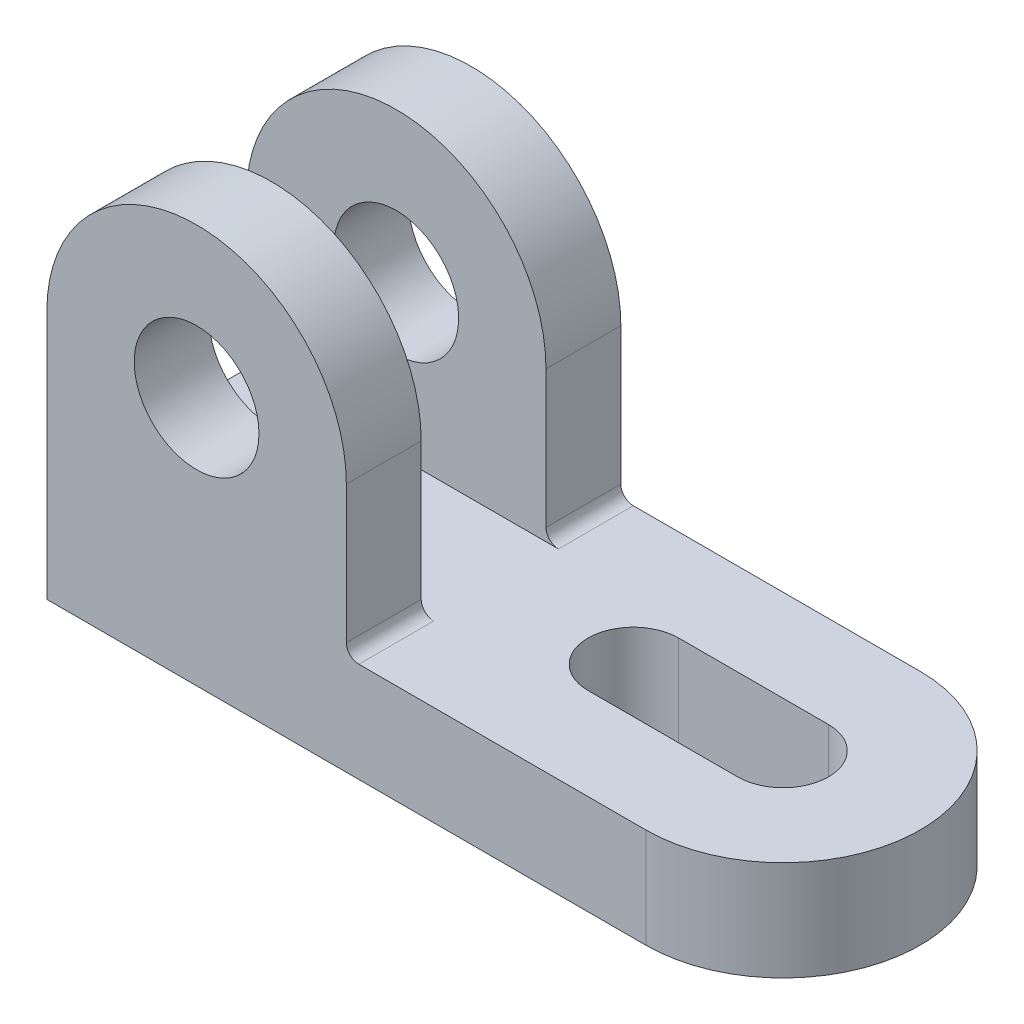
ISO-10303-21;
HEADER;
FILE_DESCRIPTION(('STEP AP214'),'2;1');
FILE_NAME('part.step','',(''),(''),'','','');
FILE_SCHEMA(('AUTOMOTIVE_DESIGN { 1 0 10303 214 1 1 1 1 }'));
ENDSEC;
DATA;
#1=APPLICATION_CONTEXT('core data for automotive mechanical design processes');
#2=APPLICATION_PROTOCOL_DEFINITION('international standard','automotive_design',2000,#1);
#3=PRODUCT_CONTEXT('',#1,'mechanical');
#4=PRODUCT('Part','Part','',(#3));
#5=PRODUCT_RELATED_PRODUCT_CATEGORY('part','',(#4));
#6=PRODUCT_DEFINITION_FORMATION('','',#4);
#7=PRODUCT_DEFINITION_CONTEXT('part definition',#1,'design');
#8=PRODUCT_DEFINITION('design','',#6,#7);
#9=PRODUCT_DEFINITION_SHAPE('','',#8);
#10=(LENGTH_UNIT() NAMED_UNIT(*) SI_UNIT(.MILLI.,.METRE.));
#11=(NAMED_UNIT(*) PLANE_ANGLE_UNIT() SI_UNIT($,.RADIAN.));
#12=(NAMED_UNIT(*) SI_UNIT($,.STERADIAN.) SOLID_ANGLE_UNIT());
#13=UNCERTAINTY_MEASURE_WITH_UNIT(LENGTH_MEASURE(1.E-05),#10,'distance_accuracy_value','');
#14=(GEOMETRIC_REPRESENTATION_CONTEXT(3) GLOBAL_UNCERTAINTY_ASSIGNED_CONTEXT((#13)) GLOBAL_UNIT_ASSIGNED_CONTEXT((#10,
#11,#12)) REPRESENTATION_CONTEXT('',''));
#15=CARTESIAN_POINT('',(0.,0.,0.));
#16=DIRECTION('',(0.,0.,1.));
#17=DIRECTION('',(1.,0.,0.));
#18=AXIS2_PLACEMENT_3D('',#15,#16,#17);
#19=CARTESIAN_POINT('',(48.,16.,0.));
#20=DIRECTION('',(0.,1.,0.));
#21=DIRECTION('',(0.,0.,1.));
#22=AXIS2_PLACEMENT_3D('',#19,#20,#21);
#23=PLANE('',#22);
#24=DIRECTION('',(-1.,0.,0.));
#25=VECTOR('',#24,1.);
#26=CARTESIAN_POINT('',(48.,16.,-7.27633480639501));
#27=LINE('',#26,#25);
#28=CARTESIAN_POINT('',(48.,16.,-7.27633480639501));
#29=VERTEX_POINT('',#28);
#30=CARTESIAN_POINT('',(24.,16.,-7.276334806395));
#31=VERTEX_POINT('',#30);
#32=EDGE_CURVE('E212',#29,#31,#27,.T.);
#33=ORIENTED_EDGE('',*,*,#32,.F.);
#34=CARTESIAN_POINT('',(48.,16.,0.));
#35=DIRECTION('',(0.,1.,0.));
#36=DIRECTION('',(0.,0.,1.));
#37=AXIS2_PLACEMENT_3D('',#34,#35,#36);
#38=CIRCLE('',#37,7.27633480639501);
#39=CARTESIAN_POINT('',(48.,16.,7.27633480639501));
#40=VERTEX_POINT('',#39);
#41=EDGE_CURVE('E210',#40,#29,#38,.T.);
#42=ORIENTED_EDGE('',*,*,#41,.F.);
#43=DIRECTION('',(1.,0.,0.));
#44=VECTOR('',#43,1.);
#45=CARTESIAN_POINT('',(48.,16.,7.27633480639501));
#46=LINE('',#45,#44);
#47=CARTESIAN_POINT('',(24.,16.,7.27633480639502));
#48=VERTEX_POINT('',#47);
#49=EDGE_CURVE('E218',#48,#40,#46,.T.);
#50=ORIENTED_EDGE('',*,*,#49,.F.);
#51=CARTESIAN_POINT('',(24.,16.,0.));
#52=DIRECTION('',(0.,1.,0.));
#53=DIRECTION('',(0.,0.,1.));
#54=AXIS2_PLACEMENT_3D('',#51,#52,#53);
#55=CIRCLE('',#54,7.27633480639501);
#56=EDGE_CURVE('E215',#31,#48,#55,.T.);
#57=ORIENTED_EDGE('',*,*,#56,.F.);
#58=EDGE_LOOP('',(#33,#42,#50,#57));
#59=FACE_BOUND('',#58,.T.);
#60=DIRECTION('',(-1.,0.,0.));
#61=VECTOR('',#60,1.);
#62=CARTESIAN_POINT('',(-48.,16.,-22.));
#63=LINE('',#62,#61);
#64=CARTESIAN_POINT('',(48.,16.,-22.));
#65=VERTEX_POINT('',#64);
#66=CARTESIAN_POINT('',(2.,16.,-22.));
#67=VERTEX_POINT('',#66);
#68=EDGE_CURVE('E244',#65,#67,#63,.T.);
#69=ORIENTED_EDGE('',*,*,#68,.T.);
#70=DIRECTION('',(0.,0.,-1.));
#71=VECTOR('',#70,1.);
#72=CARTESIAN_POINT('',(2.,16.,0.));
#73=LINE('',#72,#71);
#74=CARTESIAN_POINT('',(2.,16.,-10.));
#75=VERTEX_POINT('',#74);
#76=EDGE_CURVE('E281',#67,#75,#73,.F.);
#77=ORIENTED_EDGE('',*,*,#76,.T.);
#78=DIRECTION('',(1.,0.,0.));
#79=VECTOR('',#78,1.);
#80=CARTESIAN_POINT('',(0.,16.,-10.));
#81=LINE('',#80,#79);
#82=CARTESIAN_POINT('',(-48.,16.,-10.));
#83=VERTEX_POINT('',#82);
#84=EDGE_CURVE('E48',#83,#75,#81,.T.);
#85=ORIENTED_EDGE('',*,*,#84,.F.);
#86=DIRECTION('',(0.,0.,1.));
#87=VECTOR('',#86,1.);
#88=CARTESIAN_POINT('',(-48.,16.,-22.));
#89=LINE('',#88,#87);
#90=CARTESIAN_POINT('',(-48.,16.,10.));
#91=VERTEX_POINT('',#90);
#92=EDGE_CURVE('E167',#83,#91,#89,.T.);
#93=ORIENTED_EDGE('',*,*,#92,.T.);
#94=DIRECTION('',(-1.,0.,0.));
#95=VECTOR('',#94,1.);
#96=CARTESIAN_POINT('',(0.,16.,10.));
#97=LINE('',#96,#95);
#98=CARTESIAN_POINT('',(2.,16.,10.));
#99=VERTEX_POINT('',#98);
#100=EDGE_CURVE('E194',#99,#91,#97,.T.);
#101=ORIENTED_EDGE('',*,*,#100,.F.);
#102=DIRECTION('',(0.,0.,1.));
#103=VECTOR('',#102,1.);
#104=CARTESIAN_POINT('',(2.,16.,22.));
#105=LINE('',#104,#103);
#106=CARTESIAN_POINT('',(2.,16.,22.));
#107=VERTEX_POINT('',#106);
#108=EDGE_CURVE('E268',#99,#107,#105,.T.);
#109=ORIENTED_EDGE('',*,*,#108,.T.);
#110=DIRECTION('',(1.,0.,0.));
#111=VECTOR('',#110,1.);
#112=CARTESIAN_POINT('',(-48.,16.,22.));
#113=LINE('',#112,#111);
#114=CARTESIAN_POINT('',(48.,16.,22.));
#115=VERTEX_POINT('',#114);
#116=EDGE_CURVE('E248',#107,#115,#113,.T.);
#117=ORIENTED_EDGE('',*,*,#116,.T.);
#118=CARTESIAN_POINT('',(48.,16.,0.));
#119=DIRECTION('',(0.,1.,0.));
#120=DIRECTION('',(0.,0.,1.));
#121=AXIS2_PLACEMENT_3D('',#118,#119,#120);
#122=CIRCLE('',#121,22.);
#123=EDGE_CURVE('E241',#115,#65,#122,.T.);
#124=ORIENTED_EDGE('',*,*,#123,.T.);
#125=EDGE_LOOP('',(#69,#77,#85,#93,#101,#109,#117,#124));
#126=FACE_BOUND('',#125,.T.);
#127=ADVANCED_FACE('F34',(#59,#126),#23,.T.);
#128=CARTESIAN_POINT('',(48.,0.,0.));
#129=DIRECTION('',(0.,1.,0.));
#130=DIRECTION('',(0.,0.,1.));
#131=AXIS2_PLACEMENT_3D('',#128,#129,#130);
#132=PLANE('',#131);
#133=CARTESIAN_POINT('',(48.,0.,0.));
#134=DIRECTION('',(0.,1.,0.));
#135=DIRECTION('',(0.,0.,1.));
#136=AXIS2_PLACEMENT_3D('',#133,#134,#135);
#137=CIRCLE('',#136,22.);
#138=CARTESIAN_POINT('',(48.,0.,22.));
#139=VERTEX_POINT('',#138);
#140=CARTESIAN_POINT('',(48.,0.,-22.));
#141=VERTEX_POINT('',#140);
#142=EDGE_CURVE('E240',#139,#141,#137,.T.);
#143=ORIENTED_EDGE('',*,*,#142,.F.);
#144=DIRECTION('',(1.,0.,0.));
#145=VECTOR('',#144,1.);
#146=CARTESIAN_POINT('',(-48.,0.,22.));
#147=LINE('',#146,#145);
#148=CARTESIAN_POINT('',(-48.,0.,22.));
#149=VERTEX_POINT('',#148);
#150=EDGE_CURVE('E245',#149,#139,#147,.T.);
#151=ORIENTED_EDGE('',*,*,#150,.F.);
#152=DIRECTION('',(0.,0.,1.));
#153=VECTOR('',#152,1.);
#154=CARTESIAN_POINT('',(-48.,0.,-22.));
#155=LINE('',#154,#153);
#156=CARTESIAN_POINT('',(-48.,0.,-22.));
#157=VERTEX_POINT('',#156);
#158=EDGE_CURVE('E255',#157,#149,#155,.T.);
#159=ORIENTED_EDGE('',*,*,#158,.F.);
#160=DIRECTION('',(-1.,0.,0.));
#161=VECTOR('',#160,1.);
#162=CARTESIAN_POINT('',(-48.,0.,-22.));
#163=LINE('',#162,#161);
#164=EDGE_CURVE('E253',#141,#157,#163,.T.);
#165=ORIENTED_EDGE('',*,*,#164,.F.);
#166=EDGE_LOOP('',(#143,#151,#159,#165));
#167=FACE_BOUND('',#166,.T.);
#168=CARTESIAN_POINT('',(48.,0.,0.));
#169=DIRECTION('',(0.,1.,0.));
#170=DIRECTION('',(0.,0.,1.));
#171=AXIS2_PLACEMENT_3D('',#168,#169,#170);
#172=CIRCLE('',#171,7.27633480639501);
#173=CARTESIAN_POINT('',(48.,0.,7.27633480639501));
#174=VERTEX_POINT('',#173);
#175=CARTESIAN_POINT('',(48.,0.,-7.27633480639501));
#176=VERTEX_POINT('',#175);
#177=EDGE_CURVE('E207',#174,#176,#172,.T.);
#178=ORIENTED_EDGE('',*,*,#177,.T.);
#179=DIRECTION('',(-1.,0.,0.));
#180=VECTOR('',#179,1.);
#181=CARTESIAN_POINT('',(48.,0.,-7.27633480639501));
#182=LINE('',#181,#180);
#183=CARTESIAN_POINT('',(24.,0.,-7.276334806395));
#184=VERTEX_POINT('',#183);
#185=EDGE_CURVE('E223',#176,#184,#182,.T.);
#186=ORIENTED_EDGE('',*,*,#185,.T.);
#187=CARTESIAN_POINT('',(24.,0.,0.));
#188=DIRECTION('',(0.,1.,0.));
#189=DIRECTION('',(0.,0.,1.));
#190=AXIS2_PLACEMENT_3D('',#187,#188,#189);
#191=CIRCLE('',#190,7.27633480639501);
#192=CARTESIAN_POINT('',(24.,0.,7.27633480639502));
#193=VERTEX_POINT('',#192);
#194=EDGE_CURVE('E226',#184,#193,#191,.T.);
#195=ORIENTED_EDGE('',*,*,#194,.T.);
#196=DIRECTION('',(1.,0.,0.));
#197=VECTOR('',#196,1.);
#198=CARTESIAN_POINT('',(48.,0.,7.27633480639501));
#199=LINE('',#198,#197);
#200=EDGE_CURVE('E213',#193,#174,#199,.T.);
#201=ORIENTED_EDGE('',*,*,#200,.T.);
#202=EDGE_LOOP('',(#178,#186,#195,#201));
#203=FACE_BOUND('',#202,.T.);
#204=ADVANCED_FACE('F295',(#167,#203),#132,.F.);
#205=CARTESIAN_POINT('',(48.,16.,0.));
#206=DIRECTION('',(0.,-1.,0.));
#207=DIRECTION('',(0.,0.,-1.));
#208=AXIS2_PLACEMENT_3D('',#205,#206,#207);
#209=CYLINDRICAL_SURFACE('',#208,22.);
#210=ORIENTED_EDGE('',*,*,#142,.T.);
#211=DIRECTION('',(0.,-1.,0.));
#212=VECTOR('',#211,1.);
#213=CARTESIAN_POINT('',(48.,16.,-22.));
#214=LINE('',#213,#212);
#215=EDGE_CURVE('E265',#65,#141,#214,.T.);
#216=ORIENTED_EDGE('',*,*,#215,.F.);
#217=ORIENTED_EDGE('',*,*,#123,.F.);
#218=DIRECTION('',(0.,-1.,0.));
#219=VECTOR('',#218,1.);
#220=CARTESIAN_POINT('',(48.,16.,22.));
#221=LINE('',#220,#219);
#222=EDGE_CURVE('E250',#115,#139,#221,.T.);
#223=ORIENTED_EDGE('',*,*,#222,.T.);
#224=EDGE_LOOP('',(#210,#216,#217,#223));
#225=FACE_BOUND('',#224,.T.);
#226=ADVANCED_FACE('F304',(#225),#209,.T.);
#227=CARTESIAN_POINT('',(-48.,16.,-22.));
#228=DIRECTION('',(0.,0.,1.));
#229=DIRECTION('',(1.,0.,0.));
#230=AXIS2_PLACEMENT_3D('',#227,#228,#229);
#231=PLANE('',#230);
#232=ORIENTED_EDGE('',*,*,#164,.T.);
#233=DIRECTION('',(0.,-1.,0.));
#234=VECTOR('',#233,1.);
#235=CARTESIAN_POINT('',(-48.,16.,-22.));
#236=LINE('',#235,#234);
#237=CARTESIAN_POINT('',(-48.,40.,-22.));
#238=VERTEX_POINT('',#237);
#239=EDGE_CURVE('E263',#238,#157,#236,.T.);
#240=ORIENTED_EDGE('',*,*,#239,.F.);
#241=CARTESIAN_POINT('',(-24.,40.,-22.));
#242=DIRECTION('',(0.,0.,-1.));
#243=DIRECTION('',(-1.,0.,0.));
#244=AXIS2_PLACEMENT_3D('',#241,#242,#243);
#245=CIRCLE('',#244,24.);
#246=CARTESIAN_POINT('',(0.,40.,-22.));
#247=VERTEX_POINT('',#246);
#248=EDGE_CURVE('E153',#238,#247,#245,.T.);
#249=ORIENTED_EDGE('',*,*,#248,.T.);
#250=DIRECTION('',(0.,1.,0.));
#251=VECTOR('',#250,1.);
#252=CARTESIAN_POINT('',(0.,0.,-22.));
#253=LINE('',#252,#251);
#254=CARTESIAN_POINT('',(0.,18.,-22.));
#255=VERTEX_POINT('',#254);
#256=EDGE_CURVE('E171',#255,#247,#253,.T.);
#257=ORIENTED_EDGE('',*,*,#256,.F.);
#258=CARTESIAN_POINT('',(2.,18.,-22.));
#259=DIRECTION('',(0.,0.,1.));
#260=DIRECTION('',(1.,0.,0.));
#261=AXIS2_PLACEMENT_3D('',#258,#259,#260);
#262=CIRCLE('',#261,2.);
#263=EDGE_CURVE('E42',#255,#67,#262,.T.);
#264=ORIENTED_EDGE('',*,*,#263,.T.);
#265=ORIENTED_EDGE('',*,*,#68,.F.);
#266=ORIENTED_EDGE('',*,*,#215,.T.);
#267=EDGE_LOOP('',(#232,#240,#249,#257,#264,#265,#266));
#268=FACE_BOUND('',#267,.T.);
#269=CARTESIAN_POINT('',(-24.,40.,-22.));
#270=DIRECTION('',(0.,0.,-1.));
#271=DIRECTION('',(-1.,0.,0.));
#272=AXIS2_PLACEMENT_3D('',#269,#270,#271);
#273=CIRCLE('',#272,10.);
#274=CARTESIAN_POINT('',(-34.,40.,-22.));
#275=VERTEX_POINT('',#274);
#276=EDGE_CURVE('E176',#275,#275,#273,.T.);
#277=ORIENTED_EDGE('',*,*,#276,.F.);
#278=EDGE_LOOP('',(#277));
#279=FACE_BOUND('',#278,.T.);
#280=ADVANCED_FACE('F289',(#268,#279),#231,.F.);
#281=CARTESIAN_POINT('',(-48.,16.,-22.));
#282=DIRECTION('',(1.,0.,0.));
#283=DIRECTION('',(0.,0.,-1.));
#284=AXIS2_PLACEMENT_3D('',#281,#282,#283);
#285=PLANE('',#284);
#286=ORIENTED_EDGE('',*,*,#158,.T.);
#287=DIRECTION('',(0.,-1.,0.));
#288=VECTOR('',#287,1.);
#289=CARTESIAN_POINT('',(-48.,16.,22.));
#290=LINE('',#289,#288);
#291=CARTESIAN_POINT('',(-48.,40.,22.));
#292=VERTEX_POINT('',#291);
#293=EDGE_CURVE('E260',#292,#149,#290,.T.);
#294=ORIENTED_EDGE('',*,*,#293,.F.);
#295=DIRECTION('',(0.,0.,1.));
#296=VECTOR('',#295,1.);
#297=CARTESIAN_POINT('',(-48.,40.,10.));
#298=LINE('',#297,#296);
#299=CARTESIAN_POINT('',(-48.,40.,10.));
#300=VERTEX_POINT('',#299);
#301=EDGE_CURVE('E204',#300,#292,#298,.T.);
#302=ORIENTED_EDGE('',*,*,#301,.F.);
#303=DIRECTION('',(0.,1.,0.));
#304=VECTOR('',#303,1.);
#305=CARTESIAN_POINT('',(-48.,0.,10.));
#306=LINE('',#305,#304);
#307=EDGE_CURVE('E192',#91,#300,#306,.T.);
#308=ORIENTED_EDGE('',*,*,#307,.F.);
#309=ORIENTED_EDGE('',*,*,#92,.F.);
#310=DIRECTION('',(0.,1.,0.));
#311=VECTOR('',#310,1.);
#312=CARTESIAN_POINT('',(-48.,0.,-10.));
#313=LINE('',#312,#311);
#314=CARTESIAN_POINT('',(-48.,40.,-10.));
#315=VERTEX_POINT('',#314);
#316=EDGE_CURVE('E160',#83,#315,#313,.T.);
#317=ORIENTED_EDGE('',*,*,#316,.T.);
#318=DIRECTION('',(0.,0.,-1.));
#319=VECTOR('',#318,1.);
#320=CARTESIAN_POINT('',(-48.,40.,-10.));
#321=LINE('',#320,#319);
#322=EDGE_CURVE('E147',#315,#238,#321,.T.);
#323=ORIENTED_EDGE('',*,*,#322,.T.);
#324=ORIENTED_EDGE('',*,*,#239,.T.);
#325=EDGE_LOOP('',(#286,#294,#302,#308,#309,#317,#323,#324));
#326=FACE_BOUND('',#325,.T.);
#327=ADVANCED_FACE('F165',(#326),#285,.F.);
#328=CARTESIAN_POINT('',(-48.,16.,22.));
#329=DIRECTION('',(0.,0.,-1.));
#330=DIRECTION('',(-1.,0.,0.));
#331=AXIS2_PLACEMENT_3D('',#328,#329,#330);
#332=PLANE('',#331);
#333=ORIENTED_EDGE('',*,*,#150,.T.);
#334=ORIENTED_EDGE('',*,*,#222,.F.);
#335=ORIENTED_EDGE('',*,*,#116,.F.);
#336=CARTESIAN_POINT('',(2.,18.,22.));
#337=DIRECTION('',(0.,0.,-1.));
#338=DIRECTION('',(-1.,0.,0.));
#339=AXIS2_PLACEMENT_3D('',#336,#337,#338);
#340=CIRCLE('',#339,2.);
#341=CARTESIAN_POINT('',(0.,18.,22.));
#342=VERTEX_POINT('',#341);
#343=EDGE_CURVE('E273',#107,#342,#340,.T.);
#344=ORIENTED_EDGE('',*,*,#343,.T.);
#345=DIRECTION('',(0.,1.,0.));
#346=VECTOR('',#345,1.);
#347=CARTESIAN_POINT('',(0.,0.,22.));
#348=LINE('',#347,#346);
#349=CARTESIAN_POINT('',(0.,40.,22.));
#350=VERTEX_POINT('',#349);
#351=EDGE_CURVE('E200',#342,#350,#348,.T.);
#352=ORIENTED_EDGE('',*,*,#351,.T.);
#353=CARTESIAN_POINT('',(-24.,40.,22.));
#354=DIRECTION('',(0.,0.,1.));
#355=DIRECTION('',(1.,0.,0.));
#356=AXIS2_PLACEMENT_3D('',#353,#354,#355);
#357=CIRCLE('',#356,24.);
#358=EDGE_CURVE('E187',#350,#292,#357,.T.);
#359=ORIENTED_EDGE('',*,*,#358,.T.);
#360=ORIENTED_EDGE('',*,*,#293,.T.);
#361=EDGE_LOOP('',(#333,#334,#335,#344,#352,#359,#360));
#362=FACE_BOUND('',#361,.T.);
#363=CARTESIAN_POINT('',(-24.,40.,22.));
#364=DIRECTION('',(0.,0.,1.));
#365=DIRECTION('',(1.,0.,0.));
#366=AXIS2_PLACEMENT_3D('',#363,#364,#365);
#367=CIRCLE('',#366,10.);
#368=CARTESIAN_POINT('',(-14.,40.,22.));
#369=VERTEX_POINT('',#368);
#370=EDGE_CURVE('E181',#369,#369,#367,.T.);
#371=ORIENTED_EDGE('',*,*,#370,.F.);
#372=EDGE_LOOP('',(#371));
#373=FACE_BOUND('',#372,.T.);
#374=ADVANCED_FACE('F299',(#362,#373),#332,.F.);
#375=CARTESIAN_POINT('',(48.,16.,0.));
#376=DIRECTION('',(0.,-1.,0.));
#377=DIRECTION('',(0.,0.,-1.));
#378=AXIS2_PLACEMENT_3D('',#375,#376,#377);
#379=CYLINDRICAL_SURFACE('',#378,7.27633480639501);
#380=ORIENTED_EDGE('',*,*,#177,.F.);
#381=DIRECTION('',(0.,-1.,0.));
#382=VECTOR('',#381,1.);
#383=CARTESIAN_POINT('',(48.,16.,7.27633480639501));
#384=LINE('',#383,#382);
#385=EDGE_CURVE('E220',#40,#174,#384,.T.);
#386=ORIENTED_EDGE('',*,*,#385,.F.);
#387=ORIENTED_EDGE('',*,*,#41,.T.);
#388=DIRECTION('',(0.,-1.,0.));
#389=VECTOR('',#388,1.);
#390=CARTESIAN_POINT('',(48.,16.,-7.27633480639501));
#391=LINE('',#390,#389);
#392=EDGE_CURVE('E237',#29,#176,#391,.T.);
#393=ORIENTED_EDGE('',*,*,#392,.T.);
#394=EDGE_LOOP('',(#380,#386,#387,#393));
#395=FACE_BOUND('',#394,.T.);
#396=ADVANCED_FACE('F347',(#395),#379,.F.);
#397=CARTESIAN_POINT('',(48.,16.,-7.27633480639501));
#398=DIRECTION('',(0.,0.,1.));
#399=DIRECTION('',(1.,0.,0.));
#400=AXIS2_PLACEMENT_3D('',#397,#398,#399);
#401=PLANE('',#400);
#402=ORIENTED_EDGE('',*,*,#185,.F.);
#403=ORIENTED_EDGE('',*,*,#392,.F.);
#404=ORIENTED_EDGE('',*,*,#32,.T.);
#405=DIRECTION('',(0.,-1.,0.));
#406=VECTOR('',#405,1.);
#407=CARTESIAN_POINT('',(24.,16.,-7.276334806395));
#408=LINE('',#407,#406);
#409=EDGE_CURVE('E235',#31,#184,#408,.T.);
#410=ORIENTED_EDGE('',*,*,#409,.T.);
#411=EDGE_LOOP('',(#402,#403,#404,#410));
#412=FACE_BOUND('',#411,.T.);
#413=ADVANCED_FACE('F427',(#412),#401,.T.);
#414=CARTESIAN_POINT('',(24.,16.,0.));
#415=DIRECTION('',(0.,-1.,0.));
#416=DIRECTION('',(0.,0.,-1.));
#417=AXIS2_PLACEMENT_3D('',#414,#415,#416);
#418=CYLINDRICAL_SURFACE('',#417,7.27633480639501);
#419=ORIENTED_EDGE('',*,*,#194,.F.);
#420=ORIENTED_EDGE('',*,*,#409,.F.);
#421=ORIENTED_EDGE('',*,*,#56,.T.);
#422=DIRECTION('',(0.,-1.,0.));
#423=VECTOR('',#422,1.);
#424=CARTESIAN_POINT('',(24.,16.,7.27633480639502));
#425=LINE('',#424,#423);
#426=EDGE_CURVE('E233',#48,#193,#425,.T.);
#427=ORIENTED_EDGE('',*,*,#426,.T.);
#428=EDGE_LOOP('',(#419,#420,#421,#427));
#429=FACE_BOUND('',#428,.T.);
#430=ADVANCED_FACE('F435',(#429),#418,.F.);
#431=CARTESIAN_POINT('',(48.,16.,7.27633480639501));
#432=DIRECTION('',(0.,0.,-1.));
#433=DIRECTION('',(-1.,0.,0.));
#434=AXIS2_PLACEMENT_3D('',#431,#432,#433);
#435=PLANE('',#434);
#436=ORIENTED_EDGE('',*,*,#200,.F.);
#437=ORIENTED_EDGE('',*,*,#426,.F.);
#438=ORIENTED_EDGE('',*,*,#49,.T.);
#439=ORIENTED_EDGE('',*,*,#385,.T.);
#440=EDGE_LOOP('',(#436,#437,#438,#439));
#441=FACE_BOUND('',#440,.T.);
#442=ADVANCED_FACE('F409',(#441),#435,.T.);
#443=CARTESIAN_POINT('',(0.,0.,10.));
#444=DIRECTION('',(1.,0.,0.));
#445=DIRECTION('',(0.,0.,-1.));
#446=AXIS2_PLACEMENT_3D('',#443,#444,#445);
#447=PLANE('',#446);
#448=ORIENTED_EDGE('',*,*,#351,.F.);
#449=DIRECTION('',(0.,0.,1.));
#450=VECTOR('',#449,1.);
#451=CARTESIAN_POINT('',(0.,18.,10.));
#452=LINE('',#451,#450);
#453=CARTESIAN_POINT('',(0.,18.,10.));
#454=VERTEX_POINT('',#453);
#455=EDGE_CURVE('E271',#342,#454,#452,.F.);
#456=ORIENTED_EDGE('',*,*,#455,.T.);
#457=DIRECTION('',(0.,1.,0.));
#458=VECTOR('',#457,1.);
#459=CARTESIAN_POINT('',(0.,0.,10.));
#460=LINE('',#459,#458);
#461=CARTESIAN_POINT('',(0.,40.,10.));
#462=VERTEX_POINT('',#461);
#463=EDGE_CURVE('E186',#454,#462,#460,.T.);
#464=ORIENTED_EDGE('',*,*,#463,.T.);
#465=DIRECTION('',(0.,0.,1.));
#466=VECTOR('',#465,1.);
#467=CARTESIAN_POINT('',(0.,40.,10.));
#468=LINE('',#467,#466);
#469=EDGE_CURVE('E197',#462,#350,#468,.T.);
#470=ORIENTED_EDGE('',*,*,#469,.T.);
#471=EDGE_LOOP('',(#448,#456,#464,#470));
#472=FACE_BOUND('',#471,.T.);
#473=ADVANCED_FACE('F311',(#472),#447,.T.);
#474=CARTESIAN_POINT('',(-24.,40.,10.));
#475=DIRECTION('',(0.,0.,1.));
#476=DIRECTION('',(1.,0.,0.));
#477=AXIS2_PLACEMENT_3D('',#474,#475,#476);
#478=CYLINDRICAL_SURFACE('',#477,10.);
#479=CARTESIAN_POINT('',(-24.,40.,10.));
#480=DIRECTION('',(0.,0.,1.));
#481=DIRECTION('',(1.,0.,0.));
#482=AXIS2_PLACEMENT_3D('',#479,#480,#481);
#483=CIRCLE('',#482,10.);
#484=CARTESIAN_POINT('',(-14.,40.,10.));
#485=VERTEX_POINT('',#484);
#486=EDGE_CURVE('E183',#485,#485,#483,.T.);
#487=ORIENTED_EDGE('',*,*,#486,.F.);
#488=EDGE_LOOP('',(#487));
#489=FACE_BOUND('',#488,.T.);
#490=ORIENTED_EDGE('',*,*,#370,.T.);
#491=EDGE_LOOP('',(#490));
#492=FACE_BOUND('',#491,.T.);
#493=ADVANCED_FACE('F324',(#489,#492),#478,.F.);
#494=CARTESIAN_POINT('',(-24.,40.,10.));
#495=DIRECTION('',(0.,0.,1.));
#496=DIRECTION('',(1.,0.,0.));
#497=AXIS2_PLACEMENT_3D('',#494,#495,#496);
#498=CYLINDRICAL_SURFACE('',#497,24.);
#499=ORIENTED_EDGE('',*,*,#358,.F.);
#500=ORIENTED_EDGE('',*,*,#469,.F.);
#501=CARTESIAN_POINT('',(-24.,40.,10.));
#502=DIRECTION('',(0.,0.,1.));
#503=DIRECTION('',(1.,0.,0.));
#504=AXIS2_PLACEMENT_3D('',#501,#502,#503);
#505=CIRCLE('',#504,24.);
#506=EDGE_CURVE('E189',#462,#300,#505,.T.);
#507=ORIENTED_EDGE('',*,*,#506,.T.);
#508=ORIENTED_EDGE('',*,*,#301,.T.);
#509=EDGE_LOOP('',(#499,#500,#507,#508));
#510=FACE_BOUND('',#509,.T.);
#511=ADVANCED_FACE('F321',(#510),#498,.T.);
#512=CARTESIAN_POINT('',(0.,0.,10.));
#513=DIRECTION('',(0.,0.,1.));
#514=DIRECTION('',(1.,0.,0.));
#515=AXIS2_PLACEMENT_3D('',#512,#513,#514);
#516=PLANE('',#515);
#517=ORIENTED_EDGE('',*,*,#486,.T.);
#518=EDGE_LOOP('',(#517));
#519=FACE_BOUND('',#518,.T.);
#520=ORIENTED_EDGE('',*,*,#463,.F.);
#521=CARTESIAN_POINT('',(2.,18.,10.));
#522=DIRECTION('',(0.,0.,1.));
#523=DIRECTION('',(1.,0.,0.));
#524=AXIS2_PLACEMENT_3D('',#521,#522,#523);
#525=CIRCLE('',#524,2.);
#526=EDGE_CURVE('E275',#454,#99,#525,.T.);
#527=ORIENTED_EDGE('',*,*,#526,.T.);
#528=ORIENTED_EDGE('',*,*,#100,.T.);
#529=ORIENTED_EDGE('',*,*,#307,.T.);
#530=ORIENTED_EDGE('',*,*,#506,.F.);
#531=EDGE_LOOP('',(#520,#527,#528,#529,#530));
#532=FACE_BOUND('',#531,.T.);
#533=ADVANCED_FACE('F318',(#519,#532),#516,.F.);
#534=CARTESIAN_POINT('',(0.,0.,-10.));
#535=DIRECTION('',(-1.,0.,0.));
#536=DIRECTION('',(0.,0.,1.));
#537=AXIS2_PLACEMENT_3D('',#534,#535,#536);
#538=PLANE('',#537);
#539=DIRECTION('',(0.,1.,0.));
#540=VECTOR('',#539,1.);
#541=CARTESIAN_POINT('',(0.,0.,-10.));
#542=LINE('',#541,#540);
#543=CARTESIAN_POINT('',(0.,18.,-10.));
#544=VERTEX_POINT('',#543);
#545=CARTESIAN_POINT('',(0.,40.,-10.));
#546=VERTEX_POINT('',#545);
#547=EDGE_CURVE('E162',#544,#546,#542,.T.);
#548=ORIENTED_EDGE('',*,*,#547,.F.);
#549=DIRECTION('',(0.,0.,-1.));
#550=VECTOR('',#549,1.);
#551=CARTESIAN_POINT('',(0.,18.,-10.));
#552=LINE('',#551,#550);
#553=EDGE_CURVE('E278',#544,#255,#552,.T.);
#554=ORIENTED_EDGE('',*,*,#553,.T.);
#555=ORIENTED_EDGE('',*,*,#256,.T.);
#556=DIRECTION('',(0.,0.,-1.));
#557=VECTOR('',#556,1.);
#558=CARTESIAN_POINT('',(0.,40.,-10.));
#559=LINE('',#558,#557);
#560=EDGE_CURVE('E157',#546,#247,#559,.T.);
#561=ORIENTED_EDGE('',*,*,#560,.F.);
#562=EDGE_LOOP('',(#548,#554,#555,#561));
#563=FACE_BOUND('',#562,.T.);
#564=ADVANCED_FACE('F288',(#563),#538,.F.);
#565=CARTESIAN_POINT('',(-24.,40.,-10.));
#566=DIRECTION('',(0.,0.,-1.));
#567=DIRECTION('',(-1.,0.,0.));
#568=AXIS2_PLACEMENT_3D('',#565,#566,#567);
#569=CYLINDRICAL_SURFACE('',#568,10.);
#570=CARTESIAN_POINT('',(-24.,40.,-10.));
#571=DIRECTION('',(0.,0.,-1.));
#572=DIRECTION('',(-1.,0.,0.));
#573=AXIS2_PLACEMENT_3D('',#570,#571,#572);
#574=CIRCLE('',#573,10.);
#575=CARTESIAN_POINT('',(-34.,40.,-10.));
#576=VERTEX_POINT('',#575);
#577=EDGE_CURVE('E168',#576,#576,#574,.T.);
#578=ORIENTED_EDGE('',*,*,#577,.F.);
#579=EDGE_LOOP('',(#578));
#580=FACE_BOUND('',#579,.T.);
#581=ORIENTED_EDGE('',*,*,#276,.T.);
#582=EDGE_LOOP('',(#581));
#583=FACE_BOUND('',#582,.T.);
#584=ADVANCED_FACE('F367',(#580,#583),#569,.F.);
#585=CARTESIAN_POINT('',(-24.,40.,-10.));
#586=DIRECTION('',(0.,0.,-1.));
#587=DIRECTION('',(-1.,0.,0.));
#588=AXIS2_PLACEMENT_3D('',#585,#586,#587);
#589=CYLINDRICAL_SURFACE('',#588,24.);
#590=ORIENTED_EDGE('',*,*,#248,.F.);
#591=ORIENTED_EDGE('',*,*,#322,.F.);
#592=CARTESIAN_POINT('',(-24.,40.,-10.));
#593=DIRECTION('',(0.,0.,-1.));
#594=DIRECTION('',(-1.,0.,0.));
#595=AXIS2_PLACEMENT_3D('',#592,#593,#594);
#596=CIRCLE('',#595,24.);
#597=EDGE_CURVE('E151',#315,#546,#596,.T.);
#598=ORIENTED_EDGE('',*,*,#597,.T.);
#599=ORIENTED_EDGE('',*,*,#560,.T.);
#600=EDGE_LOOP('',(#590,#591,#598,#599));
#601=FACE_BOUND('',#600,.T.);
#602=ADVANCED_FACE('F149',(#601),#589,.T.);
#603=CARTESIAN_POINT('',(0.,0.,-10.));
#604=DIRECTION('',(0.,0.,-1.));
#605=DIRECTION('',(-1.,0.,0.));
#606=AXIS2_PLACEMENT_3D('',#603,#604,#605);
#607=PLANE('',#606);
#608=ORIENTED_EDGE('',*,*,#577,.T.);
#609=EDGE_LOOP('',(#608));
#610=FACE_BOUND('',#609,.T.);
#611=ORIENTED_EDGE('',*,*,#316,.F.);
#612=ORIENTED_EDGE('',*,*,#84,.T.);
#613=CARTESIAN_POINT('',(2.,18.,-10.));
#614=DIRECTION('',(0.,0.,-1.));
#615=DIRECTION('',(-1.,0.,0.));
#616=AXIS2_PLACEMENT_3D('',#613,#614,#615);
#617=CIRCLE('',#616,2.);
#618=EDGE_CURVE('E11',#75,#544,#617,.T.);
#619=ORIENTED_EDGE('',*,*,#618,.T.);
#620=ORIENTED_EDGE('',*,*,#547,.T.);
#621=ORIENTED_EDGE('',*,*,#597,.F.);
#622=EDGE_LOOP('',(#611,#612,#619,#620,#621));
#623=FACE_BOUND('',#622,.T.);
#624=ADVANCED_FACE('F159',(#610,#623),#607,.F.);
#625=CARTESIAN_POINT('',(2.,18.,0.));
#626=DIRECTION('',(0.,0.,-1.));
#627=DIRECTION('',(-1.,0.,0.));
#628=AXIS2_PLACEMENT_3D('',#625,#626,#627);
#629=CYLINDRICAL_SURFACE('',#628,2.);
#630=ORIENTED_EDGE('',*,*,#526,.F.);
#631=ORIENTED_EDGE('',*,*,#455,.F.);
#632=ORIENTED_EDGE('',*,*,#343,.F.);
#633=ORIENTED_EDGE('',*,*,#108,.F.);
#634=EDGE_LOOP('',(#630,#631,#632,#633));
#635=FACE_BOUND('',#634,.T.);
#636=ADVANCED_FACE('F316',(#635),#629,.F.);
#637=CARTESIAN_POINT('',(2.,18.,-10.));
#638=DIRECTION('',(0.,0.,-1.));
#639=DIRECTION('',(-1.,0.,0.));
#640=AXIS2_PLACEMENT_3D('',#637,#638,#639);
#641=CYLINDRICAL_SURFACE('',#640,2.);
#642=ORIENTED_EDGE('',*,*,#618,.F.);
#643=ORIENTED_EDGE('',*,*,#76,.F.);
#644=ORIENTED_EDGE('',*,*,#263,.F.);
#645=ORIENTED_EDGE('',*,*,#553,.F.);
#646=EDGE_LOOP('',(#642,#643,#644,#645));
#647=FACE_BOUND('',#646,.T.);
#648=ADVANCED_FACE('F36',(#647),#641,.F.);
#649=CLOSED_SHELL('',(#127,#204,#226,#280,#327,#374,#396,#413,#430,#442,#473,#493,#511,#533,
#564,#584,#602,#624,#636,#648));
#650=MANIFOLD_SOLID_BREP('B2',#649);
#651=ADVANCED_BREP_SHAPE_REPRESENTATION('',(#18,#650),#14);
#652=SHAPE_DEFINITION_REPRESENTATION(#9,#651);
ENDSEC;
END-ISO-10303-21;
